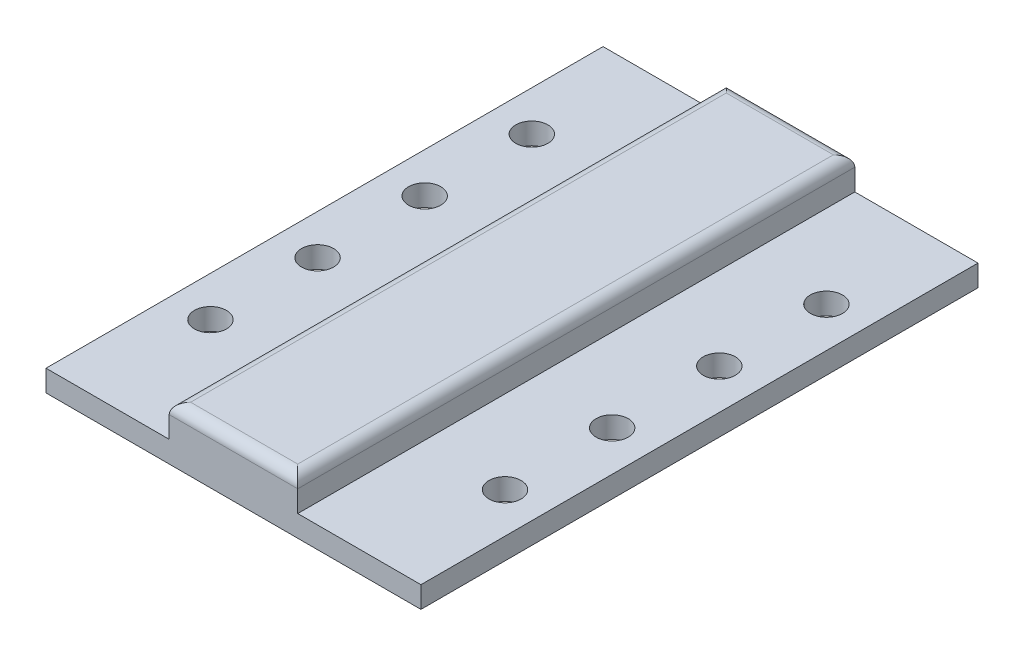
ISO-10303-21;
HEADER;
FILE_DESCRIPTION(('STEP AP214'),'2;1');
FILE_NAME('part.step','',(''),(''),'','','');
FILE_SCHEMA(('AUTOMOTIVE_DESIGN { 1 0 10303 214 1 1 1 1 }'));
ENDSEC;
DATA;
#1=APPLICATION_CONTEXT('core data for automotive mechanical design processes');
#2=APPLICATION_PROTOCOL_DEFINITION('international standard','automotive_design',2000,#1);
#3=PRODUCT_CONTEXT('',#1,'mechanical');
#4=PRODUCT('Part','Part','',(#3));
#5=PRODUCT_RELATED_PRODUCT_CATEGORY('part','',(#4));
#6=PRODUCT_DEFINITION_FORMATION('','',#4);
#7=PRODUCT_DEFINITION_CONTEXT('part definition',#1,'design');
#8=PRODUCT_DEFINITION('design','',#6,#7);
#9=PRODUCT_DEFINITION_SHAPE('','',#8);
#10=(LENGTH_UNIT() NAMED_UNIT(*) SI_UNIT(.MILLI.,.METRE.));
#11=(NAMED_UNIT(*) PLANE_ANGLE_UNIT() SI_UNIT($,.RADIAN.));
#12=(NAMED_UNIT(*) SI_UNIT($,.STERADIAN.) SOLID_ANGLE_UNIT());
#13=UNCERTAINTY_MEASURE_WITH_UNIT(LENGTH_MEASURE(1.E-05),#10,'distance_accuracy_value','');
#14=(GEOMETRIC_REPRESENTATION_CONTEXT(3) GLOBAL_UNCERTAINTY_ASSIGNED_CONTEXT((#13)) GLOBAL_UNIT_ASSIGNED_CONTEXT((#10,
#11,#12)) REPRESENTATION_CONTEXT('',''));
#15=CARTESIAN_POINT('',(0.,0.,0.));
#16=DIRECTION('',(0.,0.,1.));
#17=DIRECTION('',(1.,0.,0.));
#18=AXIS2_PLACEMENT_3D('',#15,#16,#17);
#19=CARTESIAN_POINT('',(0.,2.,0.));
#20=DIRECTION('',(0.,1.,0.));
#21=DIRECTION('',(0.,0.,1.));
#22=AXIS2_PLACEMENT_3D('',#19,#20,#21);
#23=PLANE('',#22);
#24=CARTESIAN_POINT('',(-13.7500000000002,2.,-5.60000000000058));
#25=DIRECTION('',(0.,1.,0.));
#26=DIRECTION('',(0.,0.,1.));
#27=AXIS2_PLACEMENT_3D('',#24,#25,#26);
#28=CIRCLE('',#27,1.50000000000006);
#29=CARTESIAN_POINT('',(-13.7500000000002,2.,-4.10000000000052));
#30=VERTEX_POINT('',#29);
#31=EDGE_CURVE('E230',#30,#30,#28,.T.);
#32=ORIENTED_EDGE('',*,*,#31,.F.);
#33=EDGE_LOOP('',(#32));
#34=FACE_BOUND('',#33,.T.);
#35=CARTESIAN_POINT('',(-13.7500000000003,2.,-15.6000000000006));
#36=DIRECTION('',(0.,1.,0.));
#37=DIRECTION('',(0.,0.,1.));
#38=AXIS2_PLACEMENT_3D('',#35,#36,#37);
#39=CIRCLE('',#38,1.50000000000006);
#40=CARTESIAN_POINT('',(-13.7500000000003,2.,-14.1000000000005));
#41=VERTEX_POINT('',#40);
#42=EDGE_CURVE('E236',#41,#41,#39,.T.);
#43=ORIENTED_EDGE('',*,*,#42,.F.);
#44=EDGE_LOOP('',(#43));
#45=FACE_BOUND('',#44,.T.);
#46=CARTESIAN_POINT('',(-13.75,2.,14.3999999999994));
#47=DIRECTION('',(0.,1.,0.));
#48=DIRECTION('',(0.,0.,1.));
#49=AXIS2_PLACEMENT_3D('',#46,#47,#48);
#50=CIRCLE('',#49,1.50000000000006);
#51=CARTESIAN_POINT('',(-13.75,2.,15.8999999999995));
#52=VERTEX_POINT('',#51);
#53=EDGE_CURVE('E213',#52,#52,#50,.T.);
#54=ORIENTED_EDGE('',*,*,#53,.F.);
#55=EDGE_LOOP('',(#54));
#56=FACE_BOUND('',#55,.T.);
#57=CARTESIAN_POINT('',(-13.7500000000001,2.,4.39999999999942));
#58=DIRECTION('',(0.,1.,0.));
#59=DIRECTION('',(0.,0.,1.));
#60=AXIS2_PLACEMENT_3D('',#57,#58,#59);
#61=CIRCLE('',#60,1.50000000000006);
#62=CARTESIAN_POINT('',(-13.7500000000001,2.,5.89999999999948));
#63=VERTEX_POINT('',#62);
#64=EDGE_CURVE('E224',#63,#63,#61,.T.);
#65=ORIENTED_EDGE('',*,*,#64,.F.);
#66=EDGE_LOOP('',(#65));
#67=FACE_BOUND('',#66,.T.);
#68=DIRECTION('',(1.,0.,0.));
#69=VECTOR('',#68,1.);
#70=CARTESIAN_POINT('',(17.5,2.,26.));
#71=LINE('',#70,#69);
#72=CARTESIAN_POINT('',(-17.5,2.,26.));
#73=VERTEX_POINT('',#72);
#74=CARTESIAN_POINT('',(-6.,2.,26.));
#75=VERTEX_POINT('',#74);
#76=EDGE_CURVE('E144',#73,#75,#71,.T.);
#77=ORIENTED_EDGE('',*,*,#76,.T.);
#78=DIRECTION('',(0.,0.,-1.));
#79=VECTOR('',#78,1.);
#80=CARTESIAN_POINT('',(-6.,2.,38.369316876853));
#81=LINE('',#80,#79);
#82=CARTESIAN_POINT('',(-6.,2.,-26.));
#83=VERTEX_POINT('',#82);
#84=EDGE_CURVE('E130',#75,#83,#81,.T.);
#85=ORIENTED_EDGE('',*,*,#84,.T.);
#86=DIRECTION('',(-1.,0.,0.));
#87=VECTOR('',#86,1.);
#88=CARTESIAN_POINT('',(17.5,2.,-26.));
#89=LINE('',#88,#87);
#90=CARTESIAN_POINT('',(-17.5,2.,-26.));
#91=VERTEX_POINT('',#90);
#92=EDGE_CURVE('E137',#83,#91,#89,.T.);
#93=ORIENTED_EDGE('',*,*,#92,.T.);
#94=DIRECTION('',(0.,0.,1.));
#95=VECTOR('',#94,1.);
#96=CARTESIAN_POINT('',(-17.5,2.,26.));
#97=LINE('',#96,#95);
#98=EDGE_CURVE('E136',#91,#73,#97,.T.);
#99=ORIENTED_EDGE('',*,*,#98,.T.);
#100=EDGE_LOOP('',(#77,#85,#93,#99));
#101=FACE_BOUND('',#100,.T.);
#102=ADVANCED_FACE('F34',(#34,#45,#56,#67,#101),#23,.T.);
#103=CARTESIAN_POINT('',(17.5,2.,26.));
#104=DIRECTION('',(-1.,0.,0.));
#105=DIRECTION('',(0.,0.,1.));
#106=AXIS2_PLACEMENT_3D('',#103,#104,#105);
#107=PLANE('',#106);
#108=DIRECTION('',(0.,0.,-1.));
#109=VECTOR('',#108,1.);
#110=CARTESIAN_POINT('',(17.5,0.,26.));
#111=LINE('',#110,#109);
#112=CARTESIAN_POINT('',(17.5,0.,26.));
#113=VERTEX_POINT('',#112);
#114=CARTESIAN_POINT('',(17.5,0.,-26.));
#115=VERTEX_POINT('',#114);
#116=EDGE_CURVE('E148',#113,#115,#111,.T.);
#117=ORIENTED_EDGE('',*,*,#116,.T.);
#118=DIRECTION('',(0.,-1.,0.));
#119=VECTOR('',#118,1.);
#120=CARTESIAN_POINT('',(17.5,2.,-26.));
#121=LINE('',#120,#119);
#122=CARTESIAN_POINT('',(17.5,2.,-26.));
#123=VERTEX_POINT('',#122);
#124=EDGE_CURVE('E166',#123,#115,#121,.T.);
#125=ORIENTED_EDGE('',*,*,#124,.F.);
#126=DIRECTION('',(0.,0.,-1.));
#127=VECTOR('',#126,1.);
#128=CARTESIAN_POINT('',(17.5,2.,26.));
#129=LINE('',#128,#127);
#130=CARTESIAN_POINT('',(17.5,2.,26.));
#131=VERTEX_POINT('',#130);
#132=EDGE_CURVE('E134',#131,#123,#129,.T.);
#133=ORIENTED_EDGE('',*,*,#132,.F.);
#134=DIRECTION('',(0.,-1.,0.));
#135=VECTOR('',#134,1.);
#136=CARTESIAN_POINT('',(17.5,2.,26.));
#137=LINE('',#136,#135);
#138=EDGE_CURVE('E147',#131,#113,#137,.T.);
#139=ORIENTED_EDGE('',*,*,#138,.T.);
#140=EDGE_LOOP('',(#117,#125,#133,#139));
#141=FACE_BOUND('',#140,.T.);
#142=ADVANCED_FACE('F277',(#141),#107,.F.);
#143=CARTESIAN_POINT('',(17.5,2.,-26.));
#144=DIRECTION('',(0.,0.,1.));
#145=DIRECTION('',(1.,0.,0.));
#146=AXIS2_PLACEMENT_3D('',#143,#144,#145);
#147=PLANE('',#146);
#148=DIRECTION('',(0.,1.,0.));
#149=VECTOR('',#148,1.);
#150=CARTESIAN_POINT('',(-6.,2.,-26.));
#151=LINE('',#150,#149);
#152=CARTESIAN_POINT('',(-6.,4.,-26.));
#153=VERTEX_POINT('',#152);
#154=EDGE_CURVE('E121',#83,#153,#151,.T.);
#155=ORIENTED_EDGE('',*,*,#154,.T.);
#156=DIRECTION('',(1.,0.,0.));
#157=VECTOR('',#156,1.);
#158=CARTESIAN_POINT('',(17.5,4.,-26.));
#159=LINE('',#158,#157);
#160=CARTESIAN_POINT('',(6.,4.,-26.));
#161=VERTEX_POINT('',#160);
#162=EDGE_CURVE('E120',#153,#161,#159,.T.);
#163=ORIENTED_EDGE('',*,*,#162,.T.);
#164=DIRECTION('',(0.,-1.,0.));
#165=VECTOR('',#164,1.);
#166=CARTESIAN_POINT('',(6.,2.,-26.));
#167=LINE('',#166,#165);
#168=CARTESIAN_POINT('',(6.,2.,-26.));
#169=VERTEX_POINT('',#168);
#170=EDGE_CURVE('E111',#161,#169,#167,.T.);
#171=ORIENTED_EDGE('',*,*,#170,.T.);
#172=EDGE_CURVE('E117',#123,#169,#89,.T.);
#173=ORIENTED_EDGE('',*,*,#172,.F.);
#174=ORIENTED_EDGE('',*,*,#124,.T.);
#175=DIRECTION('',(-1.,0.,0.));
#176=VECTOR('',#175,1.);
#177=CARTESIAN_POINT('',(17.5,0.,-26.));
#178=LINE('',#177,#176);
#179=CARTESIAN_POINT('',(-17.5,0.,-26.));
#180=VERTEX_POINT('',#179);
#181=EDGE_CURVE('E151',#115,#180,#178,.T.);
#182=ORIENTED_EDGE('',*,*,#181,.T.);
#183=DIRECTION('',(0.,-1.,0.));
#184=VECTOR('',#183,1.);
#185=CARTESIAN_POINT('',(-17.5,2.,-26.));
#186=LINE('',#185,#184);
#187=EDGE_CURVE('E163',#91,#180,#186,.T.);
#188=ORIENTED_EDGE('',*,*,#187,.F.);
#189=ORIENTED_EDGE('',*,*,#92,.F.);
#190=EDGE_LOOP('',(#155,#163,#171,#173,#174,#182,#188,#189));
#191=FACE_BOUND('',#190,.T.);
#192=ADVANCED_FACE('F114',(#191),#147,.F.);
#193=CARTESIAN_POINT('',(-17.5,2.,26.));
#194=DIRECTION('',(1.,0.,0.));
#195=DIRECTION('',(0.,0.,-1.));
#196=AXIS2_PLACEMENT_3D('',#193,#194,#195);
#197=PLANE('',#196);
#198=DIRECTION('',(0.,0.,1.));
#199=VECTOR('',#198,1.);
#200=CARTESIAN_POINT('',(-17.5,0.,26.));
#201=LINE('',#200,#199);
#202=CARTESIAN_POINT('',(-17.5,0.,26.));
#203=VERTEX_POINT('',#202);
#204=EDGE_CURVE('E154',#180,#203,#201,.T.);
#205=ORIENTED_EDGE('',*,*,#204,.T.);
#206=DIRECTION('',(0.,-1.,0.));
#207=VECTOR('',#206,1.);
#208=CARTESIAN_POINT('',(-17.5,2.,26.));
#209=LINE('',#208,#207);
#210=EDGE_CURVE('E160',#73,#203,#209,.T.);
#211=ORIENTED_EDGE('',*,*,#210,.F.);
#212=ORIENTED_EDGE('',*,*,#98,.F.);
#213=ORIENTED_EDGE('',*,*,#187,.T.);
#214=EDGE_LOOP('',(#205,#211,#212,#213));
#215=FACE_BOUND('',#214,.T.);
#216=ADVANCED_FACE('F257',(#215),#197,.F.);
#217=CARTESIAN_POINT('',(17.5,2.,26.));
#218=DIRECTION('',(0.,0.,-1.));
#219=DIRECTION('',(-1.,0.,0.));
#220=AXIS2_PLACEMENT_3D('',#217,#218,#219);
#221=PLANE('',#220);
#222=DIRECTION('',(0.,-1.,0.));
#223=VECTOR('',#222,1.);
#224=CARTESIAN_POINT('',(6.,2.,26.));
#225=LINE('',#224,#223);
#226=CARTESIAN_POINT('',(6.,4.,26.));
#227=VERTEX_POINT('',#226);
#228=CARTESIAN_POINT('',(6.,2.,26.));
#229=VERTEX_POINT('',#228);
#230=EDGE_CURVE('E127',#227,#229,#225,.T.);
#231=ORIENTED_EDGE('',*,*,#230,.F.);
#232=DIRECTION('',(1.,0.,0.));
#233=VECTOR('',#232,1.);
#234=CARTESIAN_POINT('',(17.5,4.,26.));
#235=LINE('',#234,#233);
#236=CARTESIAN_POINT('',(-6.,4.,26.));
#237=VERTEX_POINT('',#236);
#238=EDGE_CURVE('E51',#227,#237,#235,.F.);
#239=ORIENTED_EDGE('',*,*,#238,.T.);
#240=DIRECTION('',(0.,1.,0.));
#241=VECTOR('',#240,1.);
#242=CARTESIAN_POINT('',(-6.,2.,26.));
#243=LINE('',#242,#241);
#244=EDGE_CURVE('E152',#75,#237,#243,.T.);
#245=ORIENTED_EDGE('',*,*,#244,.F.);
#246=ORIENTED_EDGE('',*,*,#76,.F.);
#247=ORIENTED_EDGE('',*,*,#210,.T.);
#248=DIRECTION('',(1.,0.,0.));
#249=VECTOR('',#248,1.);
#250=CARTESIAN_POINT('',(17.5,0.,26.));
#251=LINE('',#250,#249);
#252=EDGE_CURVE('E156',#203,#113,#251,.T.);
#253=ORIENTED_EDGE('',*,*,#252,.T.);
#254=ORIENTED_EDGE('',*,*,#138,.F.);
#255=EDGE_CURVE('E139',#229,#131,#71,.T.);
#256=ORIENTED_EDGE('',*,*,#255,.F.);
#257=EDGE_LOOP('',(#231,#239,#245,#246,#247,#253,#254,#256));
#258=FACE_BOUND('',#257,.T.);
#259=ADVANCED_FACE('F259',(#258),#221,.F.);
#260=CARTESIAN_POINT('',(13.7499999999999,2.,4.39999999999942));
#261=DIRECTION('',(0.,1.,0.));
#262=DIRECTION('',(0.,0.,1.));
#263=AXIS2_PLACEMENT_3D('',#260,#261,#262);
#264=CIRCLE('',#263,1.49999999999994);
#265=CARTESIAN_POINT('',(13.7499999999999,2.,5.89999999999937));
#266=VERTEX_POINT('',#265);
#267=EDGE_CURVE('E228',#266,#266,#264,.T.);
#268=ORIENTED_EDGE('',*,*,#267,.F.);
#269=EDGE_LOOP('',(#268));
#270=FACE_BOUND('',#269,.T.);
#271=CARTESIAN_POINT('',(13.7499999999998,2.,-5.60000000000058));
#272=DIRECTION('',(0.,1.,0.));
#273=DIRECTION('',(0.,0.,1.));
#274=AXIS2_PLACEMENT_3D('',#271,#272,#273);
#275=CIRCLE('',#274,1.49999999999994);
#276=CARTESIAN_POINT('',(13.7499999999998,2.,-4.10000000000063));
#277=VERTEX_POINT('',#276);
#278=EDGE_CURVE('E233',#277,#277,#275,.T.);
#279=ORIENTED_EDGE('',*,*,#278,.F.);
#280=EDGE_LOOP('',(#279));
#281=FACE_BOUND('',#280,.T.);
#282=CARTESIAN_POINT('',(13.75,2.,14.3999999999994));
#283=DIRECTION('',(0.,1.,0.));
#284=DIRECTION('',(0.,0.,1.));
#285=AXIS2_PLACEMENT_3D('',#282,#283,#284);
#286=CIRCLE('',#285,1.49999999999994);
#287=CARTESIAN_POINT('',(13.75,2.,15.8999999999994));
#288=VERTEX_POINT('',#287);
#289=EDGE_CURVE('E219',#288,#288,#286,.T.);
#290=ORIENTED_EDGE('',*,*,#289,.F.);
#291=EDGE_LOOP('',(#290));
#292=FACE_BOUND('',#291,.T.);
#293=CARTESIAN_POINT('',(13.7499999999997,2.,-15.6000000000006));
#294=DIRECTION('',(0.,1.,0.));
#295=DIRECTION('',(0.,0.,1.));
#296=AXIS2_PLACEMENT_3D('',#293,#294,#295);
#297=CIRCLE('',#296,1.49999999999994);
#298=CARTESIAN_POINT('',(13.7499999999997,2.,-14.1000000000006));
#299=VERTEX_POINT('',#298);
#300=EDGE_CURVE('E172',#299,#299,#297,.T.);
#301=ORIENTED_EDGE('',*,*,#300,.F.);
#302=EDGE_LOOP('',(#301));
#303=FACE_BOUND('',#302,.T.);
#304=DIRECTION('',(0.,0.,-1.));
#305=VECTOR('',#304,1.);
#306=CARTESIAN_POINT('',(6.,2.,38.369316876853));
#307=LINE('',#306,#305);
#308=EDGE_CURVE('E125',#229,#169,#307,.T.);
#309=ORIENTED_EDGE('',*,*,#308,.F.);
#310=ORIENTED_EDGE('',*,*,#255,.T.);
#311=ORIENTED_EDGE('',*,*,#132,.T.);
#312=ORIENTED_EDGE('',*,*,#172,.T.);
#313=EDGE_LOOP('',(#309,#310,#311,#312));
#314=FACE_BOUND('',#313,.T.);
#315=ADVANCED_FACE('F132',(#270,#281,#292,#303,#314),#23,.T.);
#316=CARTESIAN_POINT('',(0.,0.,0.));
#317=DIRECTION('',(0.,1.,0.));
#318=DIRECTION('',(0.,0.,1.));
#319=AXIS2_PLACEMENT_3D('',#316,#317,#318);
#320=PLANE('',#319);
#321=CARTESIAN_POINT('',(13.7499999999999,0.,4.39999999999942));
#322=DIRECTION('',(0.,1.,0.));
#323=DIRECTION('',(0.,0.,1.));
#324=AXIS2_PLACEMENT_3D('',#321,#322,#323);
#325=CIRCLE('',#324,1.49999999999994);
#326=CARTESIAN_POINT('',(13.7499999999999,0.,5.89999999999937));
#327=VERTEX_POINT('',#326);
#328=EDGE_CURVE('E122',#327,#327,#325,.T.);
#329=ORIENTED_EDGE('',*,*,#328,.T.);
#330=EDGE_LOOP('',(#329));
#331=FACE_BOUND('',#330,.T.);
#332=CARTESIAN_POINT('',(-13.7500000000002,0.,-5.60000000000058));
#333=DIRECTION('',(0.,1.,0.));
#334=DIRECTION('',(0.,0.,1.));
#335=AXIS2_PLACEMENT_3D('',#332,#333,#334);
#336=CIRCLE('',#335,1.50000000000006);
#337=CARTESIAN_POINT('',(-13.7500000000002,0.,-4.10000000000052));
#338=VERTEX_POINT('',#337);
#339=EDGE_CURVE('E187',#338,#338,#336,.T.);
#340=ORIENTED_EDGE('',*,*,#339,.T.);
#341=EDGE_LOOP('',(#340));
#342=FACE_BOUND('',#341,.T.);
#343=CARTESIAN_POINT('',(13.7499999999998,0.,-5.60000000000058));
#344=DIRECTION('',(0.,1.,0.));
#345=DIRECTION('',(0.,0.,1.));
#346=AXIS2_PLACEMENT_3D('',#343,#344,#345);
#347=CIRCLE('',#346,1.49999999999994);
#348=CARTESIAN_POINT('',(13.7499999999998,0.,-4.10000000000063));
#349=VERTEX_POINT('',#348);
#350=EDGE_CURVE('E184',#349,#349,#347,.T.);
#351=ORIENTED_EDGE('',*,*,#350,.T.);
#352=EDGE_LOOP('',(#351));
#353=FACE_BOUND('',#352,.T.);
#354=CARTESIAN_POINT('',(-13.7500000000003,0.,-15.6000000000006));
#355=DIRECTION('',(0.,1.,0.));
#356=DIRECTION('',(0.,0.,1.));
#357=AXIS2_PLACEMENT_3D('',#354,#355,#356);
#358=CIRCLE('',#357,1.50000000000006);
#359=CARTESIAN_POINT('',(-13.7500000000003,0.,-14.1000000000005));
#360=VERTEX_POINT('',#359);
#361=EDGE_CURVE('E181',#360,#360,#358,.T.);
#362=ORIENTED_EDGE('',*,*,#361,.T.);
#363=EDGE_LOOP('',(#362));
#364=FACE_BOUND('',#363,.T.);
#365=CARTESIAN_POINT('',(-13.75,0.,14.3999999999994));
#366=DIRECTION('',(0.,1.,0.));
#367=DIRECTION('',(0.,0.,1.));
#368=AXIS2_PLACEMENT_3D('',#365,#366,#367);
#369=CIRCLE('',#368,1.50000000000006);
#370=CARTESIAN_POINT('',(-13.75,0.,15.8999999999995));
#371=VERTEX_POINT('',#370);
#372=EDGE_CURVE('E178',#371,#371,#369,.T.);
#373=ORIENTED_EDGE('',*,*,#372,.T.);
#374=EDGE_LOOP('',(#373));
#375=FACE_BOUND('',#374,.T.);
#376=CARTESIAN_POINT('',(13.75,0.,14.3999999999994));
#377=DIRECTION('',(0.,1.,0.));
#378=DIRECTION('',(0.,0.,1.));
#379=AXIS2_PLACEMENT_3D('',#376,#377,#378);
#380=CIRCLE('',#379,1.49999999999994);
#381=CARTESIAN_POINT('',(13.75,0.,15.8999999999994));
#382=VERTEX_POINT('',#381);
#383=EDGE_CURVE('E175',#382,#382,#380,.T.);
#384=ORIENTED_EDGE('',*,*,#383,.T.);
#385=EDGE_LOOP('',(#384));
#386=FACE_BOUND('',#385,.T.);
#387=CARTESIAN_POINT('',(-13.7500000000001,0.,4.39999999999942));
#388=DIRECTION('',(0.,1.,0.));
#389=DIRECTION('',(0.,0.,1.));
#390=AXIS2_PLACEMENT_3D('',#387,#388,#389);
#391=CIRCLE('',#390,1.50000000000006);
#392=CARTESIAN_POINT('',(-13.7500000000001,0.,5.89999999999948));
#393=VERTEX_POINT('',#392);
#394=EDGE_CURVE('E171',#393,#393,#391,.T.);
#395=ORIENTED_EDGE('',*,*,#394,.T.);
#396=EDGE_LOOP('',(#395));
#397=FACE_BOUND('',#396,.T.);
#398=CARTESIAN_POINT('',(13.7499999999997,0.,-15.6000000000006));
#399=DIRECTION('',(0.,1.,0.));
#400=DIRECTION('',(0.,0.,1.));
#401=AXIS2_PLACEMENT_3D('',#398,#399,#400);
#402=CIRCLE('',#401,1.49999999999994);
#403=CARTESIAN_POINT('',(13.7499999999997,0.,-14.1000000000006));
#404=VERTEX_POINT('',#403);
#405=EDGE_CURVE('E168',#404,#404,#402,.T.);
#406=ORIENTED_EDGE('',*,*,#405,.T.);
#407=EDGE_LOOP('',(#406));
#408=FACE_BOUND('',#407,.T.);
#409=ORIENTED_EDGE('',*,*,#116,.F.);
#410=ORIENTED_EDGE('',*,*,#252,.F.);
#411=ORIENTED_EDGE('',*,*,#204,.F.);
#412=ORIENTED_EDGE('',*,*,#181,.F.);
#413=EDGE_LOOP('',(#409,#410,#411,#412));
#414=FACE_BOUND('',#413,.T.);
#415=ADVANCED_FACE('F290',(#331,#342,#353,#364,#375,#386,#397,#408,#414),#320,.F.);
#416=CARTESIAN_POINT('',(-6.,5.,38.369316876853));
#417=DIRECTION('',(0.,-1.,0.));
#418=DIRECTION('',(1.,0.,0.));
#419=AXIS2_PLACEMENT_3D('',#416,#417,#418);
#420=PLANE('',#419);
#421=DIRECTION('',(1.,0.,0.));
#422=VECTOR('',#421,1.);
#423=CARTESIAN_POINT('',(-6.,5.,-25.));
#424=LINE('',#423,#422);
#425=CARTESIAN_POINT('',(5.,5.,-25.));
#426=VERTEX_POINT('',#425);
#427=CARTESIAN_POINT('',(-5.,5.,-25.));
#428=VERTEX_POINT('',#427);
#429=EDGE_CURVE('E197',#426,#428,#424,.F.);
#430=ORIENTED_EDGE('',*,*,#429,.T.);
#431=DIRECTION('',(0.,0.,-1.));
#432=VECTOR('',#431,1.);
#433=CARTESIAN_POINT('',(-5.,5.,38.369316876853));
#434=LINE('',#433,#432);
#435=CARTESIAN_POINT('',(-5.,5.,25.));
#436=VERTEX_POINT('',#435);
#437=EDGE_CURVE('E200',#428,#436,#434,.F.);
#438=ORIENTED_EDGE('',*,*,#437,.T.);
#439=DIRECTION('',(1.,0.,0.));
#440=VECTOR('',#439,1.);
#441=CARTESIAN_POINT('',(-6.,5.,25.));
#442=LINE('',#441,#440);
#443=CARTESIAN_POINT('',(5.,5.,25.));
#444=VERTEX_POINT('',#443);
#445=EDGE_CURVE('E195',#436,#444,#442,.T.);
#446=ORIENTED_EDGE('',*,*,#445,.T.);
#447=DIRECTION('',(0.,0.,-1.));
#448=VECTOR('',#447,1.);
#449=CARTESIAN_POINT('',(5.,5.,38.369316876853));
#450=LINE('',#449,#448);
#451=EDGE_CURVE('E193',#444,#426,#450,.T.);
#452=ORIENTED_EDGE('',*,*,#451,.T.);
#453=EDGE_LOOP('',(#430,#438,#446,#452));
#454=FACE_BOUND('',#453,.T.);
#455=ADVANCED_FACE('F296',(#454),#420,.F.);
#456=CARTESIAN_POINT('',(6.,2.,38.369316876853));
#457=DIRECTION('',(-1.,0.,0.));
#458=DIRECTION('',(0.,0.,1.));
#459=AXIS2_PLACEMENT_3D('',#456,#457,#458);
#460=PLANE('',#459);
#461=ORIENTED_EDGE('',*,*,#170,.F.);
#462=DIRECTION('',(0.,0.,-1.));
#463=VECTOR('',#462,1.);
#464=CARTESIAN_POINT('',(6.,4.,38.369316876853));
#465=LINE('',#464,#463);
#466=EDGE_CURVE('E11',#161,#227,#465,.F.);
#467=ORIENTED_EDGE('',*,*,#466,.T.);
#468=ORIENTED_EDGE('',*,*,#230,.T.);
#469=ORIENTED_EDGE('',*,*,#308,.T.);
#470=EDGE_LOOP('',(#461,#467,#468,#469));
#471=FACE_BOUND('',#470,.T.);
#472=ADVANCED_FACE('F126',(#471),#460,.F.);
#473=CARTESIAN_POINT('',(-6.,2.,38.369316876853));
#474=DIRECTION('',(1.,0.,0.));
#475=DIRECTION('',(0.,0.,-1.));
#476=AXIS2_PLACEMENT_3D('',#473,#474,#475);
#477=PLANE('',#476);
#478=ORIENTED_EDGE('',*,*,#244,.T.);
#479=DIRECTION('',(0.,0.,-1.));
#480=VECTOR('',#479,1.);
#481=CARTESIAN_POINT('',(-6.,4.,38.369316876853));
#482=LINE('',#481,#480);
#483=EDGE_CURVE('E43',#237,#153,#482,.T.);
#484=ORIENTED_EDGE('',*,*,#483,.T.);
#485=ORIENTED_EDGE('',*,*,#154,.F.);
#486=ORIENTED_EDGE('',*,*,#84,.F.);
#487=EDGE_LOOP('',(#478,#484,#485,#486));
#488=FACE_BOUND('',#487,.T.);
#489=ADVANCED_FACE('F260',(#488),#477,.F.);
#490=CARTESIAN_POINT('',(13.7499999999997,-8.,-15.6000000000006));
#491=DIRECTION('',(0.,1.,0.));
#492=DIRECTION('',(0.,0.,1.));
#493=AXIS2_PLACEMENT_3D('',#490,#491,#492);
#494=CYLINDRICAL_SURFACE('',#493,1.49999999999994);
#495=ORIENTED_EDGE('',*,*,#300,.T.);
#496=EDGE_LOOP('',(#495));
#497=FACE_BOUND('',#496,.T.);
#498=ORIENTED_EDGE('',*,*,#405,.F.);
#499=EDGE_LOOP('',(#498));
#500=FACE_BOUND('',#499,.T.);
#501=ADVANCED_FACE('F308',(#497,#500),#494,.F.);
#502=CARTESIAN_POINT('',(-13.7500000000001,-8.,4.39999999999942));
#503=DIRECTION('',(0.,1.,0.));
#504=DIRECTION('',(0.,0.,1.));
#505=AXIS2_PLACEMENT_3D('',#502,#503,#504);
#506=CYLINDRICAL_SURFACE('',#505,1.50000000000006);
#507=ORIENTED_EDGE('',*,*,#64,.T.);
#508=EDGE_LOOP('',(#507));
#509=FACE_BOUND('',#508,.T.);
#510=ORIENTED_EDGE('',*,*,#394,.F.);
#511=EDGE_LOOP('',(#510));
#512=FACE_BOUND('',#511,.T.);
#513=ADVANCED_FACE('F311',(#509,#512),#506,.F.);
#514=CARTESIAN_POINT('',(13.75,-8.,14.3999999999994));
#515=DIRECTION('',(0.,1.,0.));
#516=DIRECTION('',(0.,0.,1.));
#517=AXIS2_PLACEMENT_3D('',#514,#515,#516);
#518=CYLINDRICAL_SURFACE('',#517,1.49999999999994);
#519=ORIENTED_EDGE('',*,*,#289,.T.);
#520=EDGE_LOOP('',(#519));
#521=FACE_BOUND('',#520,.T.);
#522=ORIENTED_EDGE('',*,*,#383,.F.);
#523=EDGE_LOOP('',(#522));
#524=FACE_BOUND('',#523,.T.);
#525=ADVANCED_FACE('F322',(#521,#524),#518,.F.);
#526=CARTESIAN_POINT('',(-13.75,-8.,14.3999999999994));
#527=DIRECTION('',(0.,1.,0.));
#528=DIRECTION('',(0.,0.,1.));
#529=AXIS2_PLACEMENT_3D('',#526,#527,#528);
#530=CYLINDRICAL_SURFACE('',#529,1.50000000000006);
#531=ORIENTED_EDGE('',*,*,#53,.T.);
#532=EDGE_LOOP('',(#531));
#533=FACE_BOUND('',#532,.T.);
#534=ORIENTED_EDGE('',*,*,#372,.F.);
#535=EDGE_LOOP('',(#534));
#536=FACE_BOUND('',#535,.T.);
#537=ADVANCED_FACE('F394',(#533,#536),#530,.F.);
#538=CARTESIAN_POINT('',(-13.7500000000003,-8.,-15.6000000000006));
#539=DIRECTION('',(0.,1.,0.));
#540=DIRECTION('',(0.,0.,1.));
#541=AXIS2_PLACEMENT_3D('',#538,#539,#540);
#542=CYLINDRICAL_SURFACE('',#541,1.50000000000006);
#543=ORIENTED_EDGE('',*,*,#42,.T.);
#544=EDGE_LOOP('',(#543));
#545=FACE_BOUND('',#544,.T.);
#546=ORIENTED_EDGE('',*,*,#361,.F.);
#547=EDGE_LOOP('',(#546));
#548=FACE_BOUND('',#547,.T.);
#549=ADVANCED_FACE('F387',(#545,#548),#542,.F.);
#550=CARTESIAN_POINT('',(13.7499999999998,-8.,-5.60000000000058));
#551=DIRECTION('',(0.,1.,0.));
#552=DIRECTION('',(0.,0.,1.));
#553=AXIS2_PLACEMENT_3D('',#550,#551,#552);
#554=CYLINDRICAL_SURFACE('',#553,1.49999999999994);
#555=ORIENTED_EDGE('',*,*,#278,.T.);
#556=EDGE_LOOP('',(#555));
#557=FACE_BOUND('',#556,.T.);
#558=ORIENTED_EDGE('',*,*,#350,.F.);
#559=EDGE_LOOP('',(#558));
#560=FACE_BOUND('',#559,.T.);
#561=ADVANCED_FACE('F328',(#557,#560),#554,.F.);
#562=CARTESIAN_POINT('',(-13.7500000000002,-8.,-5.60000000000058));
#563=DIRECTION('',(0.,1.,0.));
#564=DIRECTION('',(0.,0.,1.));
#565=AXIS2_PLACEMENT_3D('',#562,#563,#564);
#566=CYLINDRICAL_SURFACE('',#565,1.50000000000006);
#567=ORIENTED_EDGE('',*,*,#31,.T.);
#568=EDGE_LOOP('',(#567));
#569=FACE_BOUND('',#568,.T.);
#570=ORIENTED_EDGE('',*,*,#339,.F.);
#571=EDGE_LOOP('',(#570));
#572=FACE_BOUND('',#571,.T.);
#573=ADVANCED_FACE('F372',(#569,#572),#566,.F.);
#574=CARTESIAN_POINT('',(13.7499999999999,-8.,4.39999999999942));
#575=DIRECTION('',(0.,1.,0.));
#576=DIRECTION('',(0.,0.,1.));
#577=AXIS2_PLACEMENT_3D('',#574,#575,#576);
#578=CYLINDRICAL_SURFACE('',#577,1.49999999999994);
#579=ORIENTED_EDGE('',*,*,#267,.T.);
#580=EDGE_LOOP('',(#579));
#581=FACE_BOUND('',#580,.T.);
#582=ORIENTED_EDGE('',*,*,#328,.F.);
#583=EDGE_LOOP('',(#582));
#584=FACE_BOUND('',#583,.T.);
#585=ADVANCED_FACE('F348',(#581,#584),#578,.F.);
#586=CARTESIAN_POINT('',(-6.,4.,25.));
#587=DIRECTION('',(1.,0.,0.));
#588=DIRECTION('',(0.,1.,0.));
#589=AXIS2_PLACEMENT_3D('',#586,#587,#588);
#590=CYLINDRICAL_SURFACE('',#589,1.);
#591=CARTESIAN_POINT('',(5.,4.,25.));
#592=DIRECTION('',(0.707106781186547,0.,-0.707106781186547));
#593=DIRECTION('',(-0.707106781186547,0.,-0.707106781186547));
#594=AXIS2_PLACEMENT_3D('',#591,#592,#593);
#595=ELLIPSE('',#594,1.41421356237309,1.);
#596=EDGE_CURVE('E207',#444,#227,#595,.T.);
#597=ORIENTED_EDGE('',*,*,#596,.F.);
#598=ORIENTED_EDGE('',*,*,#445,.F.);
#599=CARTESIAN_POINT('',(-5.,4.,25.));
#600=DIRECTION('',(-0.707106781186547,0.,-0.707106781186547));
#601=DIRECTION('',(0.707106781186547,0.,-0.707106781186547));
#602=AXIS2_PLACEMENT_3D('',#599,#600,#601);
#603=ELLIPSE('',#602,1.41421356237309,1.);
#604=EDGE_CURVE('E38',#237,#436,#603,.T.);
#605=ORIENTED_EDGE('',*,*,#604,.F.);
#606=ORIENTED_EDGE('',*,*,#238,.F.);
#607=EDGE_LOOP('',(#597,#598,#605,#606));
#608=FACE_BOUND('',#607,.T.);
#609=ADVANCED_FACE('F36',(#608),#590,.T.);
#610=CARTESIAN_POINT('',(-5.,4.,38.369316876853));
#611=DIRECTION('',(0.,0.,-1.));
#612=DIRECTION('',(-1.,0.,0.));
#613=AXIS2_PLACEMENT_3D('',#610,#611,#612);
#614=CYLINDRICAL_SURFACE('',#613,1.);
#615=ORIENTED_EDGE('',*,*,#604,.T.);
#616=ORIENTED_EDGE('',*,*,#437,.F.);
#617=CARTESIAN_POINT('',(-5.,4.,-25.));
#618=DIRECTION('',(0.707106781186547,0.,-0.707106781186547));
#619=DIRECTION('',(-0.707106781186547,0.,-0.707106781186547));
#620=AXIS2_PLACEMENT_3D('',#617,#618,#619);
#621=ELLIPSE('',#620,1.41421356237309,1.);
#622=EDGE_CURVE('E206',#153,#428,#621,.T.);
#623=ORIENTED_EDGE('',*,*,#622,.F.);
#624=ORIENTED_EDGE('',*,*,#483,.F.);
#625=EDGE_LOOP('',(#615,#616,#623,#624));
#626=FACE_BOUND('',#625,.T.);
#627=ADVANCED_FACE('F263',(#626),#614,.T.);
#628=CARTESIAN_POINT('',(5.,4.,38.369316876853));
#629=DIRECTION('',(0.,0.,-1.));
#630=DIRECTION('',(-1.,0.,0.));
#631=AXIS2_PLACEMENT_3D('',#628,#629,#630);
#632=CYLINDRICAL_SURFACE('',#631,1.);
#633=ORIENTED_EDGE('',*,*,#596,.T.);
#634=ORIENTED_EDGE('',*,*,#466,.F.);
#635=CARTESIAN_POINT('',(5.,4.,-25.));
#636=DIRECTION('',(-0.707106781186547,0.,-0.707106781186547));
#637=DIRECTION('',(0.707106781186547,0.,-0.707106781186547));
#638=AXIS2_PLACEMENT_3D('',#635,#636,#637);
#639=ELLIPSE('',#638,1.41421356237309,1.);
#640=EDGE_CURVE('E204',#426,#161,#639,.T.);
#641=ORIENTED_EDGE('',*,*,#640,.F.);
#642=ORIENTED_EDGE('',*,*,#451,.F.);
#643=EDGE_LOOP('',(#633,#634,#641,#642));
#644=FACE_BOUND('',#643,.T.);
#645=ADVANCED_FACE('F268',(#644),#632,.T.);
#646=CARTESIAN_POINT('',(17.5,4.,-25.));
#647=DIRECTION('',(1.,0.,0.));
#648=DIRECTION('',(0.,1.,0.));
#649=AXIS2_PLACEMENT_3D('',#646,#647,#648);
#650=CYLINDRICAL_SURFACE('',#649,1.);
#651=ORIENTED_EDGE('',*,*,#622,.T.);
#652=ORIENTED_EDGE('',*,*,#429,.F.);
#653=ORIENTED_EDGE('',*,*,#640,.T.);
#654=ORIENTED_EDGE('',*,*,#162,.F.);
#655=EDGE_LOOP('',(#651,#652,#653,#654));
#656=FACE_BOUND('',#655,.T.);
#657=ADVANCED_FACE('F266',(#656),#650,.T.);
#658=CLOSED_SHELL('',(#102,#142,#192,#216,#259,#315,#415,#455,#472,#489,#501,#513,#525,#537,
#549,#561,#573,#585,#609,#627,#645,#657));
#659=MANIFOLD_SOLID_BREP('B2',#658);
#660=ADVANCED_BREP_SHAPE_REPRESENTATION('',(#18,#659),#14);
#661=SHAPE_DEFINITION_REPRESENTATION(#9,#660);
ENDSEC;
END-ISO-10303-21;
